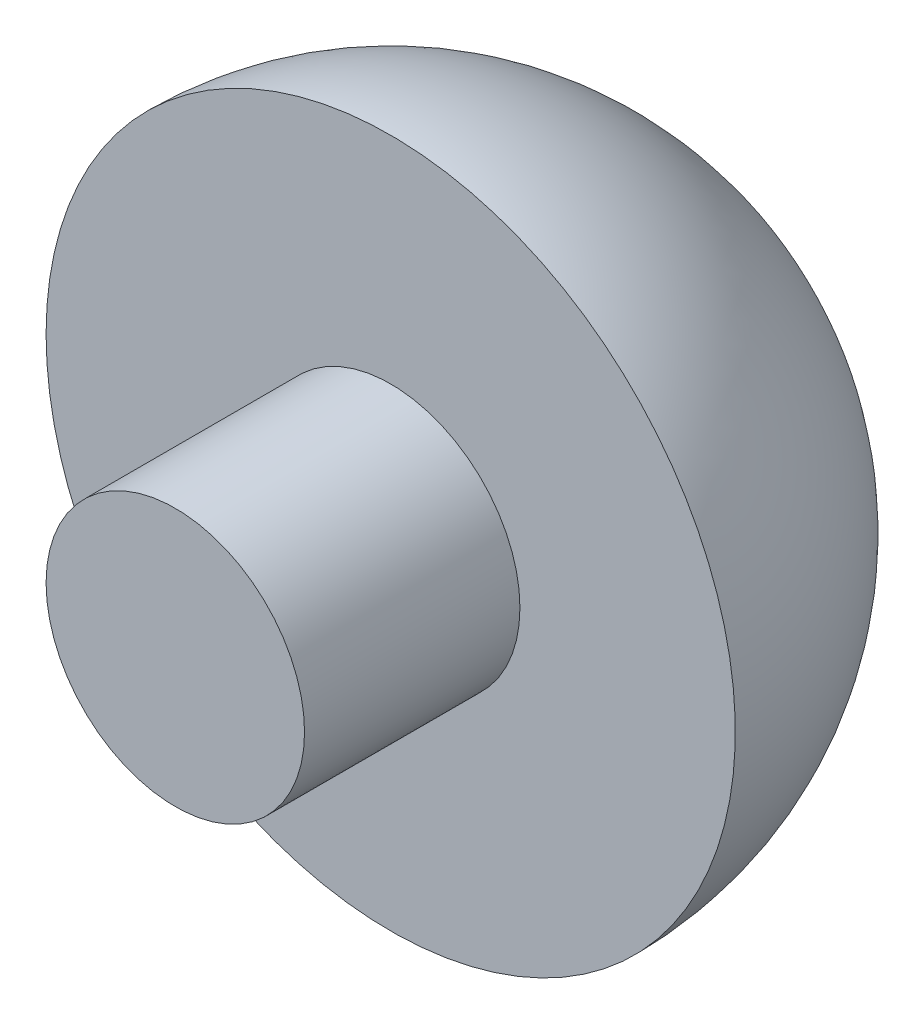
ISO-10303-21;
HEADER;
FILE_DESCRIPTION(('STEP AP214'),'2;1');
FILE_NAME('part.step','',(''),(''),'','','');
FILE_SCHEMA(('AUTOMOTIVE_DESIGN { 1 0 10303 214 1 1 1 1 }'));
ENDSEC;
DATA;
#1=APPLICATION_CONTEXT('core data for automotive mechanical design processes');
#2=APPLICATION_PROTOCOL_DEFINITION('international standard','automotive_design',2000,#1);
#3=PRODUCT_CONTEXT('',#1,'mechanical');
#4=PRODUCT('Part','Part','',(#3));
#5=PRODUCT_RELATED_PRODUCT_CATEGORY('part','',(#4));
#6=PRODUCT_DEFINITION_FORMATION('','',#4);
#7=PRODUCT_DEFINITION_CONTEXT('part definition',#1,'design');
#8=PRODUCT_DEFINITION('design','',#6,#7);
#9=PRODUCT_DEFINITION_SHAPE('','',#8);
#10=(LENGTH_UNIT() NAMED_UNIT(*) SI_UNIT(.MILLI.,.METRE.));
#11=(NAMED_UNIT(*) PLANE_ANGLE_UNIT() SI_UNIT($,.RADIAN.));
#12=(NAMED_UNIT(*) SI_UNIT($,.STERADIAN.) SOLID_ANGLE_UNIT());
#13=UNCERTAINTY_MEASURE_WITH_UNIT(LENGTH_MEASURE(1.E-05),#10,'distance_accuracy_value','');
#14=(GEOMETRIC_REPRESENTATION_CONTEXT(3) GLOBAL_UNCERTAINTY_ASSIGNED_CONTEXT((#13)) GLOBAL_UNIT_ASSIGNED_CONTEXT((#10,
#11,#12)) REPRESENTATION_CONTEXT('',''));
#15=CARTESIAN_POINT('',(0.,0.,0.));
#16=DIRECTION('',(0.,0.,1.));
#17=DIRECTION('',(1.,0.,0.));
#18=AXIS2_PLACEMENT_3D('',#15,#16,#17);
#19=CARTESIAN_POINT('',(0.,0.,0.));
#20=DIRECTION('',(0.,-1.,0.));
#21=DIRECTION('',(1.,0.,0.));
#22=AXIS2_PLACEMENT_3D('',#19,#20,#21);
#23=SPHERICAL_SURFACE('',#22,16.);
#24=CARTESIAN_POINT('',(0.,0.,0.));
#25=DIRECTION('',(0.,0.,-1.));
#26=DIRECTION('',(-1.,0.,0.));
#27=AXIS2_PLACEMENT_3D('',#24,#25,#26);
#28=SPHERICAL_SURFACE('',#27,16.);
#29=CARTESIAN_POINT('',(0.,0.,0.));
#30=DIRECTION('',(0.,0.,-1.));
#31=DIRECTION('',(-1.,0.,0.));
#32=AXIS2_PLACEMENT_3D('',#29,#30,#31);
#33=CIRCLE('',#32,16.);
#34=CARTESIAN_POINT('',(-16.,0.,1.1172740284298E-13));
#35=VERTEX_POINT('',#34);
#36=EDGE_CURVE('E38',#35,#35,#33,.T.);
#37=ORIENTED_EDGE('',*,*,#36,.T.);
#38=EDGE_LOOP('',(#37));
#39=FACE_BOUND('',#38,.T.);
#40=ADVANCED_FACE('F32',(#39),#28,.T.);
#41=CARTESIAN_POINT('',(0.,0.,0.));
#42=DIRECTION('',(0.,0.,-1.));
#43=DIRECTION('',(-1.,0.,0.));
#44=AXIS2_PLACEMENT_3D('',#41,#42,#43);
#45=PLANE('',#44);
#46=CARTESIAN_POINT('',(0.,0.,0.));
#47=DIRECTION('',(0.,0.,-1.));
#48=DIRECTION('',(-1.,0.,0.));
#49=AXIS2_PLACEMENT_3D('',#46,#47,#48);
#50=CIRCLE('',#49,6.);
#51=CARTESIAN_POINT('',(-6.,0.,0.));
#52=VERTEX_POINT('',#51);
#53=EDGE_CURVE('E10',#52,#52,#50,.F.);
#54=ORIENTED_EDGE('',*,*,#53,.F.);
#55=EDGE_LOOP('',(#54));
#56=FACE_BOUND('',#55,.T.);
#57=ORIENTED_EDGE('',*,*,#36,.F.);
#58=EDGE_LOOP('',(#57));
#59=FACE_BOUND('',#58,.T.);
#60=ADVANCED_FACE('F53',(#56,#59),#45,.F.);
#61=CARTESIAN_POINT('',(0.,0.,10.));
#62=DIRECTION('',(0.,0.,-1.));
#63=DIRECTION('',(-1.,0.,0.));
#64=AXIS2_PLACEMENT_3D('',#61,#62,#63);
#65=CYLINDRICAL_SURFACE('',#64,6.);
#66=CARTESIAN_POINT('',(0.,0.,10.));
#67=DIRECTION('',(0.,0.,1.));
#68=DIRECTION('',(1.,0.,0.));
#69=AXIS2_PLACEMENT_3D('',#66,#67,#68);
#70=CIRCLE('',#69,6.);
#71=CARTESIAN_POINT('',(6.,0.,10.));
#72=VERTEX_POINT('',#71);
#73=EDGE_CURVE('E42',#72,#72,#70,.T.);
#74=ORIENTED_EDGE('',*,*,#73,.F.);
#75=EDGE_LOOP('',(#74));
#76=FACE_BOUND('',#75,.T.);
#77=ORIENTED_EDGE('',*,*,#53,.T.);
#78=EDGE_LOOP('',(#77));
#79=FACE_BOUND('',#78,.T.);
#80=ADVANCED_FACE('F51',(#76,#79),#65,.T.);
#81=CARTESIAN_POINT('',(0.,0.,10.));
#82=DIRECTION('',(0.,0.,1.));
#83=DIRECTION('',(1.,0.,0.));
#84=AXIS2_PLACEMENT_3D('',#81,#82,#83);
#85=PLANE('',#84);
#86=ORIENTED_EDGE('',*,*,#73,.T.);
#87=EDGE_LOOP('',(#86));
#88=FACE_BOUND('',#87,.T.);
#89=ADVANCED_FACE('F49',(#88),#85,.T.);
#90=CLOSED_SHELL('',(#40,#60,#80,#89));
#91=MANIFOLD_SOLID_BREP('B2',#90);
#92=ADVANCED_BREP_SHAPE_REPRESENTATION('',(#18,#91),#14);
#93=SHAPE_DEFINITION_REPRESENTATION(#9,#92);
ENDSEC;
END-ISO-10303-21;
